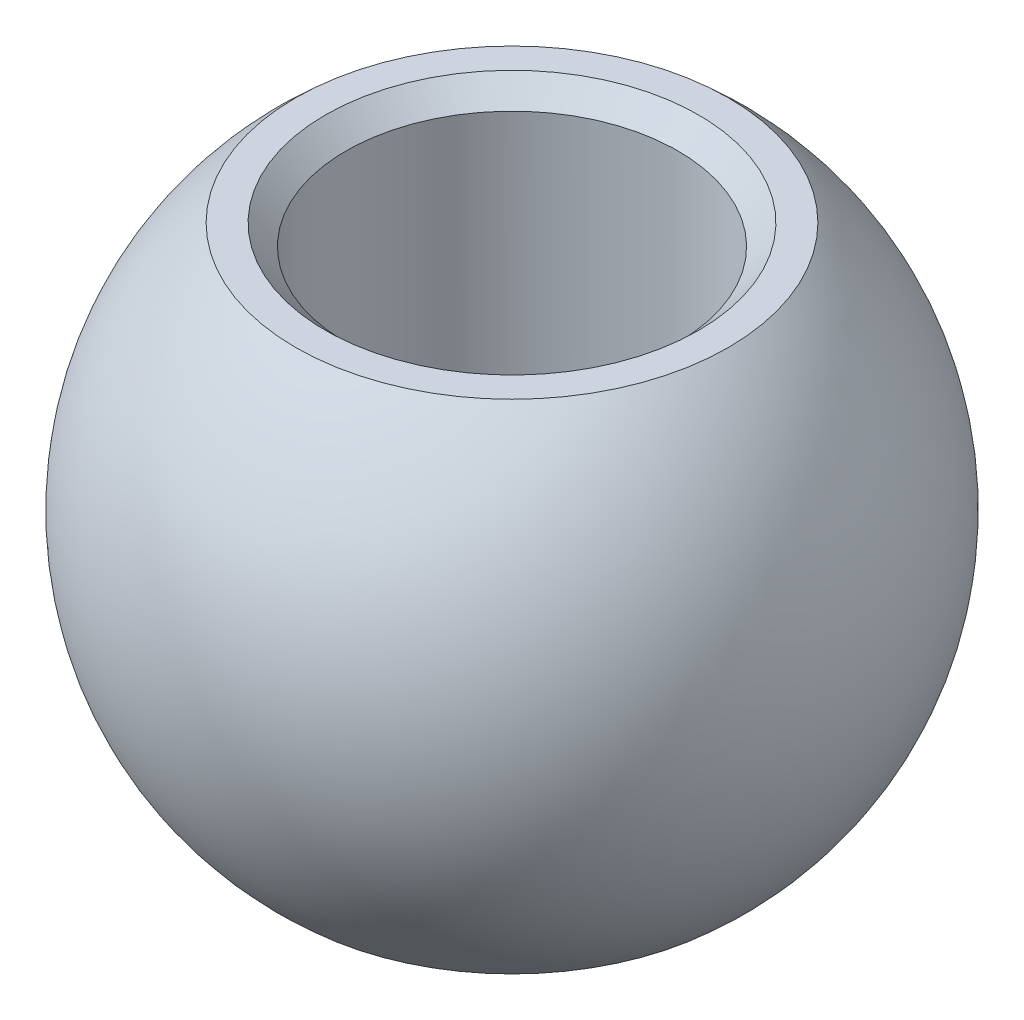
ISO-10303-21;
HEADER;
FILE_DESCRIPTION(('STEP AP214'),'2;1');
FILE_NAME('part.step','',(''),(''),'','','');
FILE_SCHEMA(('AUTOMOTIVE_DESIGN { 1 0 10303 214 1 1 1 1 }'));
ENDSEC;
DATA;
#1=APPLICATION_CONTEXT('core data for automotive mechanical design processes');
#2=APPLICATION_PROTOCOL_DEFINITION('international standard','automotive_design',2000,#1);
#3=PRODUCT_CONTEXT('',#1,'mechanical');
#4=PRODUCT('Part','Part','',(#3));
#5=PRODUCT_RELATED_PRODUCT_CATEGORY('part','',(#4));
#6=PRODUCT_DEFINITION_FORMATION('','',#4);
#7=PRODUCT_DEFINITION_CONTEXT('part definition',#1,'design');
#8=PRODUCT_DEFINITION('design','',#6,#7);
#9=PRODUCT_DEFINITION_SHAPE('','',#8);
#10=(LENGTH_UNIT() NAMED_UNIT(*) SI_UNIT(.MILLI.,.METRE.));
#11=(NAMED_UNIT(*) PLANE_ANGLE_UNIT() SI_UNIT($,.RADIAN.));
#12=(NAMED_UNIT(*) SI_UNIT($,.STERADIAN.) SOLID_ANGLE_UNIT());
#13=UNCERTAINTY_MEASURE_WITH_UNIT(LENGTH_MEASURE(1.E-05),#10,'distance_accuracy_value','');
#14=(GEOMETRIC_REPRESENTATION_CONTEXT(3) GLOBAL_UNCERTAINTY_ASSIGNED_CONTEXT((#13)) GLOBAL_UNIT_ASSIGNED_CONTEXT((#10,
#11,#12)) REPRESENTATION_CONTEXT('',''));
#15=CARTESIAN_POINT('',(0.,0.,0.));
#16=DIRECTION('',(0.,0.,1.));
#17=DIRECTION('',(1.,0.,0.));
#18=AXIS2_PLACEMENT_3D('',#15,#16,#17);
#19=CARTESIAN_POINT('',(0.,0.,0.));
#20=DIRECTION('',(0.,-1.,0.));
#21=DIRECTION('',(-1.,0.,0.));
#22=AXIS2_PLACEMENT_3D('',#19,#20,#21);
#23=SPHERICAL_SURFACE('',#22,7.95);
#24=CARTESIAN_POINT('',(0.,-6.,0.));
#25=DIRECTION('',(0.,-1.,0.));
#26=DIRECTION('',(1.,0.,0.));
#27=AXIS2_PLACEMENT_3D('',#24,#25,#26);
#28=CIRCLE('',#27,5.21560159521411);
#29=CARTESIAN_POINT('',(-5.21560159521411,-6.,0.));
#30=VERTEX_POINT('',#29);
#31=EDGE_CURVE('E59',#30,#30,#28,.T.);
#32=CARTESIAN_POINT('',(0.,6.,0.));
#33=DIRECTION('',(0.,-1.,0.));
#34=DIRECTION('',(1.,0.,0.));
#35=AXIS2_PLACEMENT_3D('',#32,#33,#34);
#36=CIRCLE('',#35,5.21560159521411);
#37=CARTESIAN_POINT('',(-5.21560159521411,6.,0.));
#38=VERTEX_POINT('',#37);
#39=EDGE_CURVE('E62',#38,#38,#36,.T.);
#40=CARTESIAN_POINT('',(-5.21560159521411,-6.,0.));
#41=CARTESIAN_POINT('',(-5.32250711829198,-5.90707570294074,0.));
#42=CARTESIAN_POINT('',(-5.42692382931034,-5.81128883773829,0.));
#43=CARTESIAN_POINT('',(-5.63049323263093,-5.61427582744523,0.));
#44=CARTESIAN_POINT('',(-5.72964592493317,-5.51304968235462,0.));
#45=CARTESIAN_POINT('',(-5.92240089622437,-5.30544396868352,0.));
#46=CARTESIAN_POINT('',(-6.01600317521335,-5.19906440010301,0.));
#47=CARTESIAN_POINT('',(-6.19739080821894,-4.98145657897561,0.));
#48=CARTESIAN_POINT('',(-6.28517616223556,-4.87022832642871,0.));
#49=CARTESIAN_POINT('',(-6.45467896941082,-4.64324061106531,0.));
#50=CARTESIAN_POINT('',(-6.53639642256945,-4.52748114824882,0.));
#51=CARTESIAN_POINT('',(-6.69353007359482,-4.2917617277633,0.));
#52=CARTESIAN_POINT('',(-6.76894627146155,-4.17180177009428,0.));
#53=CARTESIAN_POINT('',(-6.91326197870016,-3.92802399341489,0.));
#54=CARTESIAN_POINT('',(-6.98216148807202,-3.80420617440451,0.));
#55=CARTESIAN_POINT('',(-7.11324701998181,-3.55306634950566,0.));
#56=CARTESIAN_POINT('',(-7.17543304251972,-3.42574434361719,0.));
#57=CARTESIAN_POINT('',(-7.29291397308314,-3.16795982294167,0.));
#58=CARTESIAN_POINT('',(-7.34820888110865,-3.03749730815461,0.));
#59=CARTESIAN_POINT('',(-7.45174964005628,-2.77380441966831,0.));
#60=CARTESIAN_POINT('',(-7.4999954909784,-2.64057404596907,0.));
#61=CARTESIAN_POINT('',(-7.58930032746816,-2.37172599527062,0.));
#62=CARTESIAN_POINT('',(-7.63035931303579,-2.23610831827141,0.));
#63=CARTESIAN_POINT('',(-7.70517313904378,-1.96287303572558,0.));
#64=CARTESIAN_POINT('',(-7.73892797948413,-1.82525543017897,0.));
#65=CARTESIAN_POINT('',(-7.79903709880212,-1.548413377804,0.));
#66=CARTESIAN_POINT('',(-7.82539137767976,-1.40918893097565,0.));
#67=CARTESIAN_POINT('',(-7.87062409621202,-1.12953087304958,0.));
#68=CARTESIAN_POINT('',(-7.88950253586663,-0.989097261951858,0.));
#69=CARTESIAN_POINT('',(-7.91972965207898,-0.707422006321973,0.));
#70=CARTESIAN_POINT('',(-7.93107832863671,-0.566180361789809,0.));
#71=CARTESIAN_POINT('',(-7.94621350259722,-0.283292478171764,0.));
#72=CARTESIAN_POINT('',(-7.95,-0.141646239085882,0.));
#73=CARTESIAN_POINT('',(-7.95,0.141646239085881,0.));
#74=CARTESIAN_POINT('',(-7.94621350259722,0.283292478171763,0.));
#75=CARTESIAN_POINT('',(-7.93107832863671,0.566180361789808,0.));
#76=CARTESIAN_POINT('',(-7.91972965207898,0.707422006321972,0.));
#77=CARTESIAN_POINT('',(-7.88950253586663,0.989097261951857,0.));
#78=CARTESIAN_POINT('',(-7.87062409621202,1.12953087304958,0.));
#79=CARTESIAN_POINT('',(-7.82539137767976,1.40918893097565,0.));
#80=CARTESIAN_POINT('',(-7.79903709880212,1.548413377804,0.));
#81=CARTESIAN_POINT('',(-7.73892797948413,1.82525543017897,0.));
#82=CARTESIAN_POINT('',(-7.70517313904378,1.96287303572558,0.));
#83=CARTESIAN_POINT('',(-7.63035931303579,2.23610831827141,0.));
#84=CARTESIAN_POINT('',(-7.58930032746816,2.37172599527062,0.));
#85=CARTESIAN_POINT('',(-7.4999954909784,2.64057404596906,0.));
#86=CARTESIAN_POINT('',(-7.45174964005628,2.77380441966831,0.));
#87=CARTESIAN_POINT('',(-7.34820888110865,3.03749730815461,0.));
#88=CARTESIAN_POINT('',(-7.29291397308315,3.16795982294166,0.));
#89=CARTESIAN_POINT('',(-7.17543304251972,3.42574434361719,0.));
#90=CARTESIAN_POINT('',(-7.11324701998181,3.55306634950566,0.));
#91=CARTESIAN_POINT('',(-6.98216148807203,3.80420617440451,0.));
#92=CARTESIAN_POINT('',(-6.91326197870016,3.92802399341489,0.));
#93=CARTESIAN_POINT('',(-6.76894627146155,4.17180177009428,0.));
#94=CARTESIAN_POINT('',(-6.69353007359482,4.2917617277633,0.));
#95=CARTESIAN_POINT('',(-6.53639642256945,4.52748114824882,0.));
#96=CARTESIAN_POINT('',(-6.45467896941082,4.64324061106531,0.));
#97=CARTESIAN_POINT('',(-6.28517616223556,4.8702283264287,0.));
#98=CARTESIAN_POINT('',(-6.19739080821894,4.98145657897561,0.));
#99=CARTESIAN_POINT('',(-6.01600317521335,5.19906440010301,0.));
#100=CARTESIAN_POINT('',(-5.92240089622437,5.30544396868352,0.));
#101=CARTESIAN_POINT('',(-5.72964592493317,5.51304968235462,0.));
#102=CARTESIAN_POINT('',(-5.63049323263093,5.61427582744523,0.));
#103=CARTESIAN_POINT('',(-5.42692382931034,5.81128883773829,0.));
#104=CARTESIAN_POINT('',(-5.32250711829198,5.90707570294074,0.));
#105=CARTESIAN_POINT('',(-5.21560159521411,6.,0.));
#106=B_SPLINE_CURVE_WITH_KNOTS('',3,(#40,#41,#42,#43,#44,#45,#46,#47,#48,#49,#50,#51,#52,#53,
#54,#55,#56,#57,#58,#59,#60,#61,#62,#63,#64,#65,#66,#67,#68,#69,#70,#71,#72,#73,#74,#75,#76,#77,
#78,#79,#80,#81,#82,#83,#84,#85,#86,#87,#88,#89,#90,#91,#92,#93,#94,#95,#96,#97,#98,#99,#100,
#101,#102,#103,#104,#105),.UNSPECIFIED.,.F.,.F.,(4,2,2,2,2,2,2,2,2,2,2,2,2,2,2,2,2,2,2,2,2,2,2,
2,2,2,2,2,2,2,2,2,4),(0.,0.424888151976814,0.849776303953627,1.27466445593044,1.69955260790725,
2.12444075988407,2.54932891186088,2.97421706383769,3.39910521581451,3.82399336779132,
4.24888151976814,4.67376967174495,5.09865782372176,5.52354597569858,5.94843412767539,
6.3733222796522,6.79821043162902,7.22309858360583,7.64798673558264,8.07287488755946,
8.49776303953627,8.92265119151308,9.3475393434899,9.77242749546671,10.1973156474435,
10.6222037994203,11.0470919513972,11.471980103374,11.8968682553508,12.3217564073276,
12.7466445593044,13.1715327112812,13.596420863258),.UNSPECIFIED.);
#107=EDGE_CURVE('BSEAM38',#30,#38,#106,.T.);
#108=ORIENTED_EDGE('',*,*,#31,.F.);
#109=ORIENTED_EDGE('',*,*,#39,.T.);
#110=ORIENTED_EDGE('',*,*,#107,.T.);
#111=ORIENTED_EDGE('',*,*,#107,.F.);
#112=EDGE_LOOP('',(#108,#110,#109,#111));
#113=FACE_BOUND('',#112,.T.);
#114=ADVANCED_FACE('F38',(#113),#23,.T.);
#115=CARTESIAN_POINT('',(-5.21560159521411,-6.,0.));
#116=DIRECTION('',(0.,1.,0.));
#117=DIRECTION('',(-1.,0.,0.));
#118=AXIS2_PLACEMENT_3D('',#115,#116,#117);
#119=PLANE('',#118);
#120=CARTESIAN_POINT('',(0.,-6.,0.));
#121=DIRECTION('',(0.,1.,0.));
#122=DIRECTION('',(-1.,0.,0.));
#123=AXIS2_PLACEMENT_3D('',#120,#121,#122);
#124=CIRCLE('',#123,4.5);
#125=CARTESIAN_POINT('',(-4.5,-6.,0.));
#126=VERTEX_POINT('',#125);
#127=EDGE_CURVE('E46',#126,#126,#124,.T.);
#128=ORIENTED_EDGE('',*,*,#127,.T.);
#129=EDGE_LOOP('',(#128));
#130=FACE_BOUND('',#129,.T.);
#131=ORIENTED_EDGE('',*,*,#31,.T.);
#132=EDGE_LOOP('',(#131));
#133=FACE_BOUND('',#132,.T.);
#134=ADVANCED_FACE('F77',(#130,#133),#119,.F.);
#135=CARTESIAN_POINT('',(0.,-6.,0.));
#136=DIRECTION('',(0.,-1.,0.));
#137=DIRECTION('',(1.,0.,0.));
#138=AXIS2_PLACEMENT_3D('',#135,#136,#137);
#139=CYLINDRICAL_SURFACE('',#138,4.);
#140=CARTESIAN_POINT('',(0.,-5.5,0.));
#141=DIRECTION('',(0.,1.,0.));
#142=DIRECTION('',(-1.,0.,0.));
#143=AXIS2_PLACEMENT_3D('',#140,#141,#142);
#144=CIRCLE('',#143,4.);
#145=CARTESIAN_POINT('',(-4.,-5.5,0.));
#146=VERTEX_POINT('',#145);
#147=EDGE_CURVE('E50',#146,#146,#144,.F.);
#148=ORIENTED_EDGE('',*,*,#147,.T.);
#149=EDGE_LOOP('',(#148));
#150=FACE_BOUND('',#149,.T.);
#151=CARTESIAN_POINT('',(0.,5.5,0.));
#152=DIRECTION('',(0.,-1.,0.));
#153=DIRECTION('',(1.,0.,0.));
#154=AXIS2_PLACEMENT_3D('',#151,#152,#153);
#155=CIRCLE('',#154,4.);
#156=CARTESIAN_POINT('',(4.,5.5,0.));
#157=VERTEX_POINT('',#156);
#158=EDGE_CURVE('E54',#157,#157,#155,.F.);
#159=ORIENTED_EDGE('',*,*,#158,.T.);
#160=EDGE_LOOP('',(#159));
#161=FACE_BOUND('',#160,.T.);
#162=ADVANCED_FACE('F70',(#150,#161),#139,.F.);
#163=CARTESIAN_POINT('',(-4.,6.,0.));
#164=DIRECTION('',(0.,-1.,0.));
#165=DIRECTION('',(1.,0.,0.));
#166=AXIS2_PLACEMENT_3D('',#163,#164,#165);
#167=PLANE('',#166);
#168=CARTESIAN_POINT('',(0.,6.,0.));
#169=DIRECTION('',(0.,-1.,0.));
#170=DIRECTION('',(1.,0.,0.));
#171=AXIS2_PLACEMENT_3D('',#168,#169,#170);
#172=CIRCLE('',#171,4.5);
#173=CARTESIAN_POINT('',(4.49999999999999,6.,0.));
#174=VERTEX_POINT('',#173);
#175=EDGE_CURVE('E10',#174,#174,#172,.T.);
#176=ORIENTED_EDGE('',*,*,#175,.T.);
#177=EDGE_LOOP('',(#176));
#178=FACE_BOUND('',#177,.T.);
#179=ORIENTED_EDGE('',*,*,#39,.F.);
#180=EDGE_LOOP('',(#179));
#181=FACE_BOUND('',#180,.T.);
#182=ADVANCED_FACE('F67',(#178,#181),#167,.F.);
#183=CARTESIAN_POINT('',(0.,-5.5,0.));
#184=DIRECTION('',(0.,-1.,0.));
#185=DIRECTION('',(1.,0.,0.));
#186=AXIS2_PLACEMENT_3D('',#183,#184,#185);
#187=CONICAL_SURFACE('',#186,4.,0.785398163397448);
#188=ORIENTED_EDGE('',*,*,#127,.F.);
#189=EDGE_LOOP('',(#188));
#190=FACE_BOUND('',#189,.T.);
#191=ORIENTED_EDGE('',*,*,#147,.F.);
#192=EDGE_LOOP('',(#191));
#193=FACE_BOUND('',#192,.T.);
#194=ADVANCED_FACE('F69',(#190,#193),#187,.F.);
#195=CARTESIAN_POINT('',(0.,6.,0.));
#196=DIRECTION('',(0.,1.,0.));
#197=DIRECTION('',(-1.,0.,0.));
#198=AXIS2_PLACEMENT_3D('',#195,#196,#197);
#199=CONICAL_SURFACE('',#198,4.5,0.785398163397443);
#200=ORIENTED_EDGE('',*,*,#158,.F.);
#201=EDGE_LOOP('',(#200));
#202=FACE_BOUND('',#201,.T.);
#203=ORIENTED_EDGE('',*,*,#175,.F.);
#204=EDGE_LOOP('',(#203));
#205=FACE_BOUND('',#204,.T.);
#206=ADVANCED_FACE('F41',(#202,#205),#199,.F.);
#207=CLOSED_SHELL('',(#114,#134,#162,#182,#194,#206));
#208=MANIFOLD_SOLID_BREP('B2',#207);
#209=ADVANCED_BREP_SHAPE_REPRESENTATION('',(#18,#208),#14);
#210=SHAPE_DEFINITION_REPRESENTATION(#9,#209);
ENDSEC;
END-ISO-10303-21;
